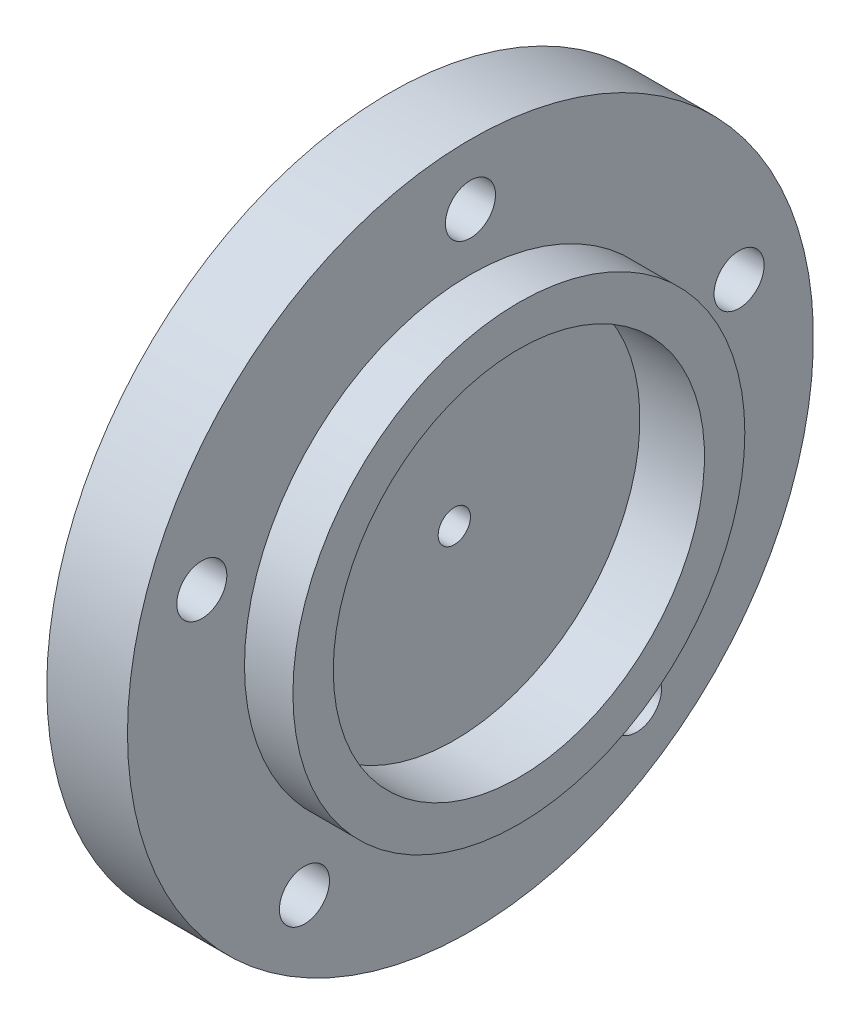
ISO-10303-21;
HEADER;
FILE_DESCRIPTION(('STEP AP214'),'2;1');
FILE_NAME('part.step','',(''),(''),'','','');
FILE_SCHEMA(('AUTOMOTIVE_DESIGN { 1 0 10303 214 1 1 1 1 }'));
ENDSEC;
DATA;
#1=APPLICATION_CONTEXT('core data for automotive mechanical design processes');
#2=APPLICATION_PROTOCOL_DEFINITION('international standard','automotive_design',2000,#1);
#3=PRODUCT_CONTEXT('',#1,'mechanical');
#4=PRODUCT('Part','Part','',(#3));
#5=PRODUCT_RELATED_PRODUCT_CATEGORY('part','',(#4));
#6=PRODUCT_DEFINITION_FORMATION('','',#4);
#7=PRODUCT_DEFINITION_CONTEXT('part definition',#1,'design');
#8=PRODUCT_DEFINITION('design','',#6,#7);
#9=PRODUCT_DEFINITION_SHAPE('','',#8);
#10=(LENGTH_UNIT() NAMED_UNIT(*) SI_UNIT(.MILLI.,.METRE.));
#11=(NAMED_UNIT(*) PLANE_ANGLE_UNIT() SI_UNIT($,.RADIAN.));
#12=(NAMED_UNIT(*) SI_UNIT($,.STERADIAN.) SOLID_ANGLE_UNIT());
#13=UNCERTAINTY_MEASURE_WITH_UNIT(LENGTH_MEASURE(1.E-05),#10,'distance_accuracy_value','');
#14=(GEOMETRIC_REPRESENTATION_CONTEXT(3) GLOBAL_UNCERTAINTY_ASSIGNED_CONTEXT((#13)) GLOBAL_UNIT_ASSIGNED_CONTEXT((#10,
#11,#12)) REPRESENTATION_CONTEXT('',''));
#15=CARTESIAN_POINT('',(0.,0.,0.));
#16=DIRECTION('',(0.,0.,1.));
#17=DIRECTION('',(1.,0.,0.));
#18=AXIS2_PLACEMENT_3D('',#15,#16,#17);
#19=CARTESIAN_POINT('',(0.,-42.5000000003732,0.));
#20=DIRECTION('',(-1.,0.,0.));
#21=DIRECTION('',(0.,0.,1.));
#22=AXIS2_PLACEMENT_3D('',#19,#20,#21);
#23=PLANE('',#22);
#24=CARTESIAN_POINT('',(0.,10.8155948031232,-33.2869780703304));
#25=DIRECTION('',(-1.,0.,0.));
#26=DIRECTION('',(0.,0.,1.));
#27=AXIS2_PLACEMENT_3D('',#24,#25,#26);
#28=CIRCLE('',#27,3.1);
#29=CARTESIAN_POINT('',(0.,10.8155948031232,-30.1869780703304));
#30=VERTEX_POINT('',#29);
#31=EDGE_CURVE('E90',#30,#30,#28,.T.);
#32=ORIENTED_EDGE('',*,*,#31,.F.);
#33=EDGE_LOOP('',(#32));
#34=FACE_BOUND('',#33,.T.);
#35=CARTESIAN_POINT('',(0.,10.8155948031232,33.2869780703304));
#36=DIRECTION('',(-1.,0.,0.));
#37=DIRECTION('',(0.,0.,1.));
#38=AXIS2_PLACEMENT_3D('',#35,#36,#37);
#39=CIRCLE('',#38,3.1);
#40=CARTESIAN_POINT('',(0.,10.8155948031232,36.3869780703304));
#41=VERTEX_POINT('',#40);
#42=EDGE_CURVE('E84',#41,#41,#39,.T.);
#43=ORIENTED_EDGE('',*,*,#42,.F.);
#44=EDGE_LOOP('',(#43));
#45=FACE_BOUND('',#44,.T.);
#46=CARTESIAN_POINT('',(0.,35.,0.));
#47=DIRECTION('',(-1.,0.,0.));
#48=DIRECTION('',(0.,0.,1.));
#49=AXIS2_PLACEMENT_3D('',#46,#47,#48);
#50=CIRCLE('',#49,3.1);
#51=CARTESIAN_POINT('',(0.,35.,3.1));
#52=VERTEX_POINT('',#51);
#53=EDGE_CURVE('E78',#52,#52,#50,.T.);
#54=ORIENTED_EDGE('',*,*,#53,.F.);
#55=EDGE_LOOP('',(#54));
#56=FACE_BOUND('',#55,.T.);
#57=CARTESIAN_POINT('',(0.,-28.3155948031232,-20.5724838302366));
#58=DIRECTION('',(-1.,0.,0.));
#59=DIRECTION('',(0.,0.,1.));
#60=AXIS2_PLACEMENT_3D('',#57,#58,#59);
#61=CIRCLE('',#60,3.1);
#62=CARTESIAN_POINT('',(0.,-28.3155948031232,-17.4724838302366));
#63=VERTEX_POINT('',#62);
#64=EDGE_CURVE('E72',#63,#63,#61,.T.);
#65=ORIENTED_EDGE('',*,*,#64,.F.);
#66=EDGE_LOOP('',(#65));
#67=FACE_BOUND('',#66,.T.);
#68=CARTESIAN_POINT('',(0.,-28.3155948031232,20.5724838302366));
#69=DIRECTION('',(-1.,0.,0.));
#70=DIRECTION('',(0.,0.,1.));
#71=AXIS2_PLACEMENT_3D('',#68,#69,#70);
#72=CIRCLE('',#71,3.1);
#73=CARTESIAN_POINT('',(0.,-28.3155948031232,23.6724838302366));
#74=VERTEX_POINT('',#73);
#75=EDGE_CURVE('E66',#74,#74,#72,.T.);
#76=ORIENTED_EDGE('',*,*,#75,.F.);
#77=EDGE_LOOP('',(#76));
#78=FACE_BOUND('',#77,.T.);
#79=CARTESIAN_POINT('',(1.11022302462516E-13,0.,0.));
#80=DIRECTION('',(-1.,0.,0.));
#81=DIRECTION('',(0.,0.,1.));
#82=AXIS2_PLACEMENT_3D('',#79,#80,#81);
#83=CIRCLE('',#82,42.5000000003732);
#84=CARTESIAN_POINT('',(1.11022302462516E-13,0.,42.5000000003732));
#85=VERTEX_POINT('',#84);
#86=EDGE_CURVE('E60',#85,#85,#83,.T.);
#87=ORIENTED_EDGE('',*,*,#86,.T.);
#88=EDGE_LOOP('',(#87));
#89=FACE_BOUND('',#88,.T.);
#90=CARTESIAN_POINT('',(0.,0.,0.));
#91=DIRECTION('',(-1.,0.,0.));
#92=DIRECTION('',(0.,0.,1.));
#93=AXIS2_PLACEMENT_3D('',#90,#91,#92);
#94=CIRCLE('',#93,2.);
#95=CARTESIAN_POINT('',(0.,0.,2.));
#96=VERTEX_POINT('',#95);
#97=EDGE_CURVE('E10',#96,#96,#94,.T.);
#98=ORIENTED_EDGE('',*,*,#97,.F.);
#99=EDGE_LOOP('',(#98));
#100=FACE_BOUND('',#99,.T.);
#101=ADVANCED_FACE('F32',(#34,#45,#56,#67,#78,#89,#100),#23,.T.);
#102=CARTESIAN_POINT('',(-696.045801993123,0.,0.));
#103=DIRECTION('',(-1.,0.,0.));
#104=DIRECTION('',(0.,0.,1.));
#105=AXIS2_PLACEMENT_3D('',#102,#103,#104);
#106=CYLINDRICAL_SURFACE('',#105,2.);
#107=ORIENTED_EDGE('',*,*,#97,.T.);
#108=EDGE_LOOP('',(#107));
#109=FACE_BOUND('',#108,.T.);
#110=CARTESIAN_POINT('',(8.00000000000001,0.,0.));
#111=DIRECTION('',(-1.,0.,0.));
#112=DIRECTION('',(0.,0.,1.));
#113=AXIS2_PLACEMENT_3D('',#110,#111,#112);
#114=CIRCLE('',#113,2.);
#115=CARTESIAN_POINT('',(8.00000000000001,0.,2.));
#116=VERTEX_POINT('',#115);
#117=EDGE_CURVE('E38',#116,#116,#114,.T.);
#118=ORIENTED_EDGE('',*,*,#117,.F.);
#119=EDGE_LOOP('',(#118));
#120=FACE_BOUND('',#119,.T.);
#121=ADVANCED_FACE('F99',(#109,#120),#106,.F.);
#122=CARTESIAN_POINT('',(8.,-2.,0.));
#123=DIRECTION('',(1.,0.,0.));
#124=DIRECTION('',(0.,0.,-1.));
#125=AXIS2_PLACEMENT_3D('',#122,#123,#124);
#126=PLANE('',#125);
#127=ORIENTED_EDGE('',*,*,#117,.T.);
#128=EDGE_LOOP('',(#127));
#129=FACE_BOUND('',#128,.T.);
#130=CARTESIAN_POINT('',(8.00000000000001,0.,0.));
#131=DIRECTION('',(-1.,0.,0.));
#132=DIRECTION('',(0.,0.,1.));
#133=AXIS2_PLACEMENT_3D('',#130,#131,#132);
#134=CIRCLE('',#133,23.);
#135=CARTESIAN_POINT('',(8.00000000000001,0.,23.));
#136=VERTEX_POINT('',#135);
#137=EDGE_CURVE('E42',#136,#136,#134,.T.);
#138=ORIENTED_EDGE('',*,*,#137,.F.);
#139=EDGE_LOOP('',(#138));
#140=FACE_BOUND('',#139,.T.);
#141=ADVANCED_FACE('F139',(#129,#140),#126,.T.);
#142=CARTESIAN_POINT('',(-696.045801993123,0.,0.));
#143=DIRECTION('',(-1.,0.,0.));
#144=DIRECTION('',(0.,0.,1.));
#145=AXIS2_PLACEMENT_3D('',#142,#143,#144);
#146=CYLINDRICAL_SURFACE('',#145,23.);
#147=ORIENTED_EDGE('',*,*,#137,.T.);
#148=EDGE_LOOP('',(#147));
#149=FACE_BOUND('',#148,.T.);
#150=CARTESIAN_POINT('',(16.,0.,0.));
#151=DIRECTION('',(-1.,0.,0.));
#152=DIRECTION('',(0.,0.,1.));
#153=AXIS2_PLACEMENT_3D('',#150,#151,#152);
#154=CIRCLE('',#153,23.);
#155=CARTESIAN_POINT('',(16.,0.,23.));
#156=VERTEX_POINT('',#155);
#157=EDGE_CURVE('E46',#156,#156,#154,.T.);
#158=ORIENTED_EDGE('',*,*,#157,.F.);
#159=EDGE_LOOP('',(#158));
#160=FACE_BOUND('',#159,.T.);
#161=ADVANCED_FACE('F135',(#149,#160),#146,.F.);
#162=CARTESIAN_POINT('',(16.,-23.,0.));
#163=DIRECTION('',(1.,0.,0.));
#164=DIRECTION('',(0.,0.,-1.));
#165=AXIS2_PLACEMENT_3D('',#162,#163,#164);
#166=PLANE('',#165);
#167=ORIENTED_EDGE('',*,*,#157,.T.);
#168=EDGE_LOOP('',(#167));
#169=FACE_BOUND('',#168,.T.);
#170=CARTESIAN_POINT('',(16.,0.,0.));
#171=DIRECTION('',(-1.,0.,0.));
#172=DIRECTION('',(0.,0.,1.));
#173=AXIS2_PLACEMENT_3D('',#170,#171,#172);
#174=CIRCLE('',#173,28.);
#175=CARTESIAN_POINT('',(16.,0.,28.));
#176=VERTEX_POINT('',#175);
#177=EDGE_CURVE('E51',#176,#176,#174,.T.);
#178=ORIENTED_EDGE('',*,*,#177,.F.);
#179=EDGE_LOOP('',(#178));
#180=FACE_BOUND('',#179,.T.);
#181=ADVANCED_FACE('F131',(#169,#180),#166,.T.);
#182=CARTESIAN_POINT('',(-696.045801993123,0.,0.));
#183=DIRECTION('',(-1.,0.,0.));
#184=DIRECTION('',(0.,0.,1.));
#185=AXIS2_PLACEMENT_3D('',#182,#183,#184);
#186=CYLINDRICAL_SURFACE('',#185,28.);
#187=ORIENTED_EDGE('',*,*,#177,.T.);
#188=EDGE_LOOP('',(#187));
#189=FACE_BOUND('',#188,.T.);
#190=CARTESIAN_POINT('',(10.,0.,0.));
#191=DIRECTION('',(-1.,0.,0.));
#192=DIRECTION('',(0.,0.,1.));
#193=AXIS2_PLACEMENT_3D('',#190,#191,#192);
#194=CIRCLE('',#193,28.);
#195=CARTESIAN_POINT('',(10.,0.,28.));
#196=VERTEX_POINT('',#195);
#197=EDGE_CURVE('E54',#196,#196,#194,.T.);
#198=ORIENTED_EDGE('',*,*,#197,.F.);
#199=EDGE_LOOP('',(#198));
#200=FACE_BOUND('',#199,.T.);
#201=ADVANCED_FACE('F124',(#189,#200),#186,.T.);
#202=CARTESIAN_POINT('',(10.,-28.,0.));
#203=DIRECTION('',(1.,0.,0.));
#204=DIRECTION('',(0.,0.,-1.));
#205=AXIS2_PLACEMENT_3D('',#202,#203,#204);
#206=PLANE('',#205);
#207=CARTESIAN_POINT('',(10.,10.8155948031232,-33.2869780703304));
#208=DIRECTION('',(1.,0.,0.));
#209=DIRECTION('',(0.,0.,-1.));
#210=AXIS2_PLACEMENT_3D('',#207,#208,#209);
#211=CIRCLE('',#210,3.1);
#212=CARTESIAN_POINT('',(10.,10.8155948031232,-36.3869780703304));
#213=VERTEX_POINT('',#212);
#214=EDGE_CURVE('E87',#213,#213,#211,.T.);
#215=ORIENTED_EDGE('',*,*,#214,.F.);
#216=EDGE_LOOP('',(#215));
#217=FACE_BOUND('',#216,.T.);
#218=CARTESIAN_POINT('',(10.,10.8155948031232,33.2869780703304));
#219=DIRECTION('',(1.,0.,0.));
#220=DIRECTION('',(0.,0.,-1.));
#221=AXIS2_PLACEMENT_3D('',#218,#219,#220);
#222=CIRCLE('',#221,3.1);
#223=CARTESIAN_POINT('',(10.,10.8155948031232,30.1869780703304));
#224=VERTEX_POINT('',#223);
#225=EDGE_CURVE('E81',#224,#224,#222,.T.);
#226=ORIENTED_EDGE('',*,*,#225,.F.);
#227=EDGE_LOOP('',(#226));
#228=FACE_BOUND('',#227,.T.);
#229=CARTESIAN_POINT('',(10.,35.,0.));
#230=DIRECTION('',(1.,0.,0.));
#231=DIRECTION('',(0.,0.,-1.));
#232=AXIS2_PLACEMENT_3D('',#229,#230,#231);
#233=CIRCLE('',#232,3.1);
#234=CARTESIAN_POINT('',(10.,35.,-3.1));
#235=VERTEX_POINT('',#234);
#236=EDGE_CURVE('E75',#235,#235,#233,.T.);
#237=ORIENTED_EDGE('',*,*,#236,.F.);
#238=EDGE_LOOP('',(#237));
#239=FACE_BOUND('',#238,.T.);
#240=CARTESIAN_POINT('',(10.,-28.3155948031232,-20.5724838302366));
#241=DIRECTION('',(1.,0.,0.));
#242=DIRECTION('',(0.,0.,-1.));
#243=AXIS2_PLACEMENT_3D('',#240,#241,#242);
#244=CIRCLE('',#243,3.1);
#245=CARTESIAN_POINT('',(10.,-28.3155948031232,-23.6724838302366));
#246=VERTEX_POINT('',#245);
#247=EDGE_CURVE('E69',#246,#246,#244,.T.);
#248=ORIENTED_EDGE('',*,*,#247,.F.);
#249=EDGE_LOOP('',(#248));
#250=FACE_BOUND('',#249,.T.);
#251=CARTESIAN_POINT('',(10.,-28.3155948031232,20.5724838302366));
#252=DIRECTION('',(1.,0.,0.));
#253=DIRECTION('',(0.,0.,-1.));
#254=AXIS2_PLACEMENT_3D('',#251,#252,#253);
#255=CIRCLE('',#254,3.1);
#256=CARTESIAN_POINT('',(10.,-28.3155948031232,17.4724838302366));
#257=VERTEX_POINT('',#256);
#258=EDGE_CURVE('E63',#257,#257,#255,.T.);
#259=ORIENTED_EDGE('',*,*,#258,.F.);
#260=EDGE_LOOP('',(#259));
#261=FACE_BOUND('',#260,.T.);
#262=ORIENTED_EDGE('',*,*,#197,.T.);
#263=EDGE_LOOP('',(#262));
#264=FACE_BOUND('',#263,.T.);
#265=CARTESIAN_POINT('',(10.,0.,0.));
#266=DIRECTION('',(-1.,0.,0.));
#267=DIRECTION('',(0.,0.,1.));
#268=AXIS2_PLACEMENT_3D('',#265,#266,#267);
#269=CIRCLE('',#268,42.5);
#270=CARTESIAN_POINT('',(10.,0.,42.5));
#271=VERTEX_POINT('',#270);
#272=EDGE_CURVE('E57',#271,#271,#269,.T.);
#273=ORIENTED_EDGE('',*,*,#272,.F.);
#274=EDGE_LOOP('',(#273));
#275=FACE_BOUND('',#274,.T.);
#276=ADVANCED_FACE('F114',(#217,#228,#239,#250,#261,#264,#275),#206,.T.);
#277=CARTESIAN_POINT('',(-696.045801993123,0.,0.));
#278=DIRECTION('',(-1.,0.,0.));
#279=DIRECTION('',(0.,0.,1.));
#280=AXIS2_PLACEMENT_3D('',#277,#278,#279);
#281=CYLINDRICAL_SURFACE('',#280,42.5000000001866);
#282=ORIENTED_EDGE('',*,*,#272,.T.);
#283=EDGE_LOOP('',(#282));
#284=FACE_BOUND('',#283,.T.);
#285=ORIENTED_EDGE('',*,*,#86,.F.);
#286=EDGE_LOOP('',(#285));
#287=FACE_BOUND('',#286,.T.);
#288=ADVANCED_FACE('F111',(#284,#287),#281,.T.);
#289=CARTESIAN_POINT('',(0.,-28.3155948031232,20.5724838302366));
#290=DIRECTION('',(-1.,0.,0.));
#291=DIRECTION('',(0.,0.,1.));
#292=AXIS2_PLACEMENT_3D('',#289,#290,#291);
#293=CYLINDRICAL_SURFACE('',#292,3.1);
#294=ORIENTED_EDGE('',*,*,#75,.T.);
#295=EDGE_LOOP('',(#294));
#296=FACE_BOUND('',#295,.T.);
#297=ORIENTED_EDGE('',*,*,#258,.T.);
#298=EDGE_LOOP('',(#297));
#299=FACE_BOUND('',#298,.T.);
#300=ADVANCED_FACE('F113',(#296,#299),#293,.F.);
#301=CARTESIAN_POINT('',(0.,-28.3155948031232,-20.5724838302366));
#302=DIRECTION('',(-1.,0.,0.));
#303=DIRECTION('',(0.,0.,1.));
#304=AXIS2_PLACEMENT_3D('',#301,#302,#303);
#305=CYLINDRICAL_SURFACE('',#304,3.1);
#306=ORIENTED_EDGE('',*,*,#64,.T.);
#307=EDGE_LOOP('',(#306));
#308=FACE_BOUND('',#307,.T.);
#309=ORIENTED_EDGE('',*,*,#247,.T.);
#310=EDGE_LOOP('',(#309));
#311=FACE_BOUND('',#310,.T.);
#312=ADVANCED_FACE('F121',(#308,#311),#305,.F.);
#313=CARTESIAN_POINT('',(0.,35.,0.));
#314=DIRECTION('',(-1.,0.,0.));
#315=DIRECTION('',(0.,0.,1.));
#316=AXIS2_PLACEMENT_3D('',#313,#314,#315);
#317=CYLINDRICAL_SURFACE('',#316,3.1);
#318=ORIENTED_EDGE('',*,*,#53,.T.);
#319=EDGE_LOOP('',(#318));
#320=FACE_BOUND('',#319,.T.);
#321=ORIENTED_EDGE('',*,*,#236,.T.);
#322=EDGE_LOOP('',(#321));
#323=FACE_BOUND('',#322,.T.);
#324=ADVANCED_FACE('F186',(#320,#323),#317,.F.);
#325=CARTESIAN_POINT('',(0.,10.8155948031232,33.2869780703304));
#326=DIRECTION('',(-1.,0.,0.));
#327=DIRECTION('',(0.,0.,1.));
#328=AXIS2_PLACEMENT_3D('',#325,#326,#327);
#329=CYLINDRICAL_SURFACE('',#328,3.1);
#330=ORIENTED_EDGE('',*,*,#42,.T.);
#331=EDGE_LOOP('',(#330));
#332=FACE_BOUND('',#331,.T.);
#333=ORIENTED_EDGE('',*,*,#225,.T.);
#334=EDGE_LOOP('',(#333));
#335=FACE_BOUND('',#334,.T.);
#336=ADVANCED_FACE('F195',(#332,#335),#329,.F.);
#337=CARTESIAN_POINT('',(0.,10.8155948031232,-33.2869780703304));
#338=DIRECTION('',(-1.,0.,0.));
#339=DIRECTION('',(0.,0.,1.));
#340=AXIS2_PLACEMENT_3D('',#337,#338,#339);
#341=CYLINDRICAL_SURFACE('',#340,3.1);
#342=ORIENTED_EDGE('',*,*,#31,.T.);
#343=EDGE_LOOP('',(#342));
#344=FACE_BOUND('',#343,.T.);
#345=ORIENTED_EDGE('',*,*,#214,.T.);
#346=EDGE_LOOP('',(#345));
#347=FACE_BOUND('',#346,.T.);
#348=ADVANCED_FACE('F94',(#344,#347),#341,.F.);
#349=CLOSED_SHELL('',(#101,#121,#141,#161,#181,#201,#276,#288,#300,#312,#324,#336,#348));
#350=MANIFOLD_SOLID_BREP('B2',#349);
#351=ADVANCED_BREP_SHAPE_REPRESENTATION('',(#18,#350),#14);
#352=SHAPE_DEFINITION_REPRESENTATION(#9,#351);
ENDSEC;
END-ISO-10303-21;
